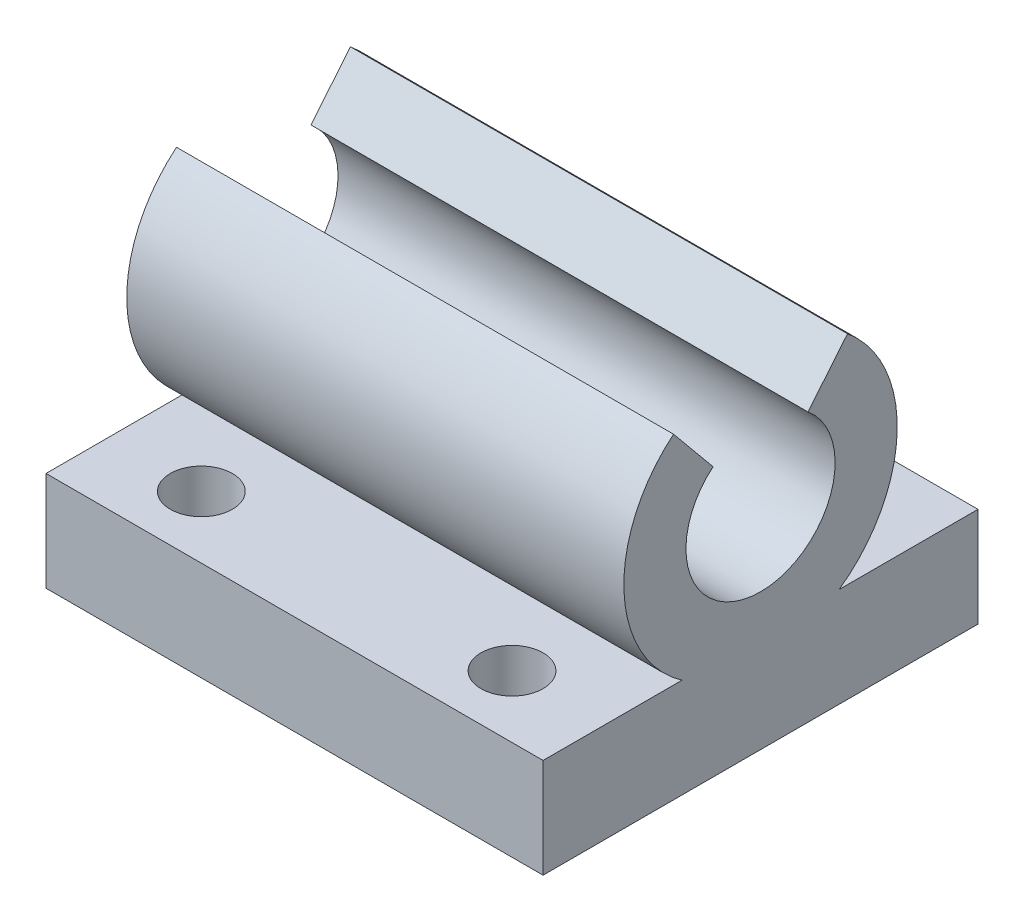
ISO-10303-21;
HEADER;
FILE_DESCRIPTION(('STEP AP214'),'2;1');
FILE_NAME('part.step','',(''),(''),'','','');
FILE_SCHEMA(('AUTOMOTIVE_DESIGN { 1 0 10303 214 1 1 1 1 }'));
ENDSEC;
DATA;
#1=APPLICATION_CONTEXT('core data for automotive mechanical design processes');
#2=APPLICATION_PROTOCOL_DEFINITION('international standard','automotive_design',2000,#1);
#3=PRODUCT_CONTEXT('',#1,'mechanical');
#4=PRODUCT('Part','Part','',(#3));
#5=PRODUCT_RELATED_PRODUCT_CATEGORY('part','',(#4));
#6=PRODUCT_DEFINITION_FORMATION('','',#4);
#7=PRODUCT_DEFINITION_CONTEXT('part definition',#1,'design');
#8=PRODUCT_DEFINITION('design','',#6,#7);
#9=PRODUCT_DEFINITION_SHAPE('','',#8);
#10=(LENGTH_UNIT() NAMED_UNIT(*) SI_UNIT(.MILLI.,.METRE.));
#11=(NAMED_UNIT(*) PLANE_ANGLE_UNIT() SI_UNIT($,.RADIAN.));
#12=(NAMED_UNIT(*) SI_UNIT($,.STERADIAN.) SOLID_ANGLE_UNIT());
#13=UNCERTAINTY_MEASURE_WITH_UNIT(LENGTH_MEASURE(1.E-05),#10,'distance_accuracy_value','');
#14=(GEOMETRIC_REPRESENTATION_CONTEXT(3) GLOBAL_UNCERTAINTY_ASSIGNED_CONTEXT((#13)) GLOBAL_UNIT_ASSIGNED_CONTEXT((#10,
#11,#12)) REPRESENTATION_CONTEXT('',''));
#15=CARTESIAN_POINT('',(0.,0.,0.));
#16=DIRECTION('',(0.,0.,1.));
#17=DIRECTION('',(1.,0.,0.));
#18=AXIS2_PLACEMENT_3D('',#15,#16,#17);
#19=CARTESIAN_POINT('',(20.,8.00000000000001,6.32455532033676));
#20=DIRECTION('',(0.,-1.,0.));
#21=DIRECTION('',(0.,0.,-1.));
#22=AXIS2_PLACEMENT_3D('',#19,#20,#21);
#23=PLANE('',#22);
#24=CARTESIAN_POINT('',(12.5,8.,12.5));
#25=DIRECTION('',(0.,-1.,0.));
#26=DIRECTION('',(0.,0.,-1.));
#27=AXIS2_PLACEMENT_3D('',#24,#25,#26);
#28=CIRCLE('',#27,2.5);
#29=CARTESIAN_POINT('',(12.5,8.00000000000001,10.));
#30=VERTEX_POINT('',#29);
#31=EDGE_CURVE('E211',#30,#30,#28,.F.);
#32=ORIENTED_EDGE('',*,*,#31,.F.);
#33=EDGE_LOOP('',(#32));
#34=FACE_BOUND('',#33,.T.);
#35=CARTESIAN_POINT('',(-12.5,8.,12.5));
#36=DIRECTION('',(0.,-1.,0.));
#37=DIRECTION('',(0.,0.,-1.));
#38=AXIS2_PLACEMENT_3D('',#35,#36,#37);
#39=CIRCLE('',#38,2.5);
#40=CARTESIAN_POINT('',(-12.5,8.00000000000001,10.));
#41=VERTEX_POINT('',#40);
#42=EDGE_CURVE('E146',#41,#41,#39,.F.);
#43=ORIENTED_EDGE('',*,*,#42,.F.);
#44=EDGE_LOOP('',(#43));
#45=FACE_BOUND('',#44,.T.);
#46=DIRECTION('',(0.,0.,1.));
#47=VECTOR('',#46,1.);
#48=CARTESIAN_POINT('',(-20.,8.00000000000001,6.32455532033676));
#49=LINE('',#48,#47);
#50=CARTESIAN_POINT('',(-20.,8.00000000000001,6.32455532033677));
#51=VERTEX_POINT('',#50);
#52=CARTESIAN_POINT('',(-20.,8.,17.5));
#53=VERTEX_POINT('',#52);
#54=EDGE_CURVE('E142',#51,#53,#49,.T.);
#55=ORIENTED_EDGE('',*,*,#54,.T.);
#56=DIRECTION('',(-1.,0.,0.));
#57=VECTOR('',#56,1.);
#58=CARTESIAN_POINT('',(20.,8.,17.5));
#59=LINE('',#58,#57);
#60=CARTESIAN_POINT('',(20.,8.,17.5));
#61=VERTEX_POINT('',#60);
#62=EDGE_CURVE('E11',#61,#53,#59,.T.);
#63=ORIENTED_EDGE('',*,*,#62,.F.);
#64=DIRECTION('',(0.,0.,1.));
#65=VECTOR('',#64,1.);
#66=CARTESIAN_POINT('',(20.,8.00000000000001,6.32455532033676));
#67=LINE('',#66,#65);
#68=CARTESIAN_POINT('',(20.,8.00000000000001,6.32455532033677));
#69=VERTEX_POINT('',#68);
#70=EDGE_CURVE('E161',#69,#61,#67,.T.);
#71=ORIENTED_EDGE('',*,*,#70,.F.);
#72=DIRECTION('',(-1.,0.,0.));
#73=VECTOR('',#72,1.);
#74=CARTESIAN_POINT('',(20.,8.00000000000001,6.32455532033677));
#75=LINE('',#74,#73);
#76=EDGE_CURVE('E138',#69,#51,#75,.T.);
#77=ORIENTED_EDGE('',*,*,#76,.T.);
#78=EDGE_LOOP('',(#55,#63,#71,#77));
#79=FACE_BOUND('',#78,.T.);
#80=ADVANCED_FACE('F34',(#34,#45,#79),#23,.F.);
#81=CARTESIAN_POINT('',(20.,8.,17.5));
#82=DIRECTION('',(0.,0.,-1.));
#83=DIRECTION('',(-1.,0.,0.));
#84=AXIS2_PLACEMENT_3D('',#81,#82,#83);
#85=PLANE('',#84);
#86=DIRECTION('',(0.,-1.,0.));
#87=VECTOR('',#86,1.);
#88=CARTESIAN_POINT('',(-20.,8.,17.5));
#89=LINE('',#88,#87);
#90=CARTESIAN_POINT('',(-20.,0.,17.5));
#91=VERTEX_POINT('',#90);
#92=EDGE_CURVE('E145',#53,#91,#89,.T.);
#93=ORIENTED_EDGE('',*,*,#92,.T.);
#94=DIRECTION('',(-1.,0.,0.));
#95=VECTOR('',#94,1.);
#96=CARTESIAN_POINT('',(20.,0.,17.5));
#97=LINE('',#96,#95);
#98=CARTESIAN_POINT('',(20.,0.,17.5));
#99=VERTEX_POINT('',#98);
#100=EDGE_CURVE('E42',#99,#91,#97,.T.);
#101=ORIENTED_EDGE('',*,*,#100,.F.);
#102=DIRECTION('',(0.,-1.,0.));
#103=VECTOR('',#102,1.);
#104=CARTESIAN_POINT('',(20.,8.,17.5));
#105=LINE('',#104,#103);
#106=EDGE_CURVE('E99',#61,#99,#105,.T.);
#107=ORIENTED_EDGE('',*,*,#106,.F.);
#108=ORIENTED_EDGE('',*,*,#62,.T.);
#109=EDGE_LOOP('',(#93,#101,#107,#108));
#110=FACE_BOUND('',#109,.T.);
#111=ADVANCED_FACE('F248',(#110),#85,.F.);
#112=CARTESIAN_POINT('',(20.,0.,17.5));
#113=DIRECTION('',(0.,1.,0.));
#114=DIRECTION('',(0.,0.,1.));
#115=AXIS2_PLACEMENT_3D('',#112,#113,#114);
#116=PLANE('',#115);
#117=CARTESIAN_POINT('',(12.5,0.,12.5));
#118=DIRECTION('',(0.,-1.,0.));
#119=DIRECTION('',(0.,0.,-1.));
#120=AXIS2_PLACEMENT_3D('',#117,#118,#119);
#121=CIRCLE('',#120,2.5);
#122=CARTESIAN_POINT('',(12.5,0.,10.));
#123=VERTEX_POINT('',#122);
#124=EDGE_CURVE('E221',#123,#123,#121,.T.);
#125=ORIENTED_EDGE('',*,*,#124,.F.);
#126=EDGE_LOOP('',(#125));
#127=FACE_BOUND('',#126,.T.);
#128=CARTESIAN_POINT('',(-12.5,0.,-12.5));
#129=DIRECTION('',(0.,-1.,0.));
#130=DIRECTION('',(0.,0.,-1.));
#131=AXIS2_PLACEMENT_3D('',#128,#129,#130);
#132=CIRCLE('',#131,2.5);
#133=CARTESIAN_POINT('',(-12.5,0.,-15.));
#134=VERTEX_POINT('',#133);
#135=EDGE_CURVE('E214',#134,#134,#132,.T.);
#136=ORIENTED_EDGE('',*,*,#135,.F.);
#137=EDGE_LOOP('',(#136));
#138=FACE_BOUND('',#137,.T.);
#139=CARTESIAN_POINT('',(12.5,0.,-12.5));
#140=DIRECTION('',(0.,-1.,0.));
#141=DIRECTION('',(0.,0.,-1.));
#142=AXIS2_PLACEMENT_3D('',#139,#140,#141);
#143=CIRCLE('',#142,2.5);
#144=CARTESIAN_POINT('',(12.5,0.,-15.));
#145=VERTEX_POINT('',#144);
#146=EDGE_CURVE('E226',#145,#145,#143,.T.);
#147=ORIENTED_EDGE('',*,*,#146,.F.);
#148=EDGE_LOOP('',(#147));
#149=FACE_BOUND('',#148,.T.);
#150=CARTESIAN_POINT('',(-12.5,0.,12.5));
#151=DIRECTION('',(0.,-1.,0.));
#152=DIRECTION('',(0.,0.,-1.));
#153=AXIS2_PLACEMENT_3D('',#150,#151,#152);
#154=CIRCLE('',#153,2.5);
#155=CARTESIAN_POINT('',(-12.5,0.,10.));
#156=VERTEX_POINT('',#155);
#157=EDGE_CURVE('E208',#156,#156,#154,.T.);
#158=ORIENTED_EDGE('',*,*,#157,.F.);
#159=EDGE_LOOP('',(#158));
#160=FACE_BOUND('',#159,.T.);
#161=DIRECTION('',(0.,0.,-1.));
#162=VECTOR('',#161,1.);
#163=CARTESIAN_POINT('',(-20.,0.,17.5));
#164=LINE('',#163,#162);
#165=CARTESIAN_POINT('',(-20.,0.,-17.5));
#166=VERTEX_POINT('',#165);
#167=EDGE_CURVE('E148',#91,#166,#164,.T.);
#168=ORIENTED_EDGE('',*,*,#167,.T.);
#169=DIRECTION('',(-1.,0.,0.));
#170=VECTOR('',#169,1.);
#171=CARTESIAN_POINT('',(20.,0.,-17.5));
#172=LINE('',#171,#170);
#173=CARTESIAN_POINT('',(20.,0.,-17.5));
#174=VERTEX_POINT('',#173);
#175=EDGE_CURVE('E174',#174,#166,#172,.T.);
#176=ORIENTED_EDGE('',*,*,#175,.F.);
#177=DIRECTION('',(0.,0.,-1.));
#178=VECTOR('',#177,1.);
#179=CARTESIAN_POINT('',(20.,0.,17.5));
#180=LINE('',#179,#178);
#181=EDGE_CURVE('E182',#99,#174,#180,.T.);
#182=ORIENTED_EDGE('',*,*,#181,.F.);
#183=ORIENTED_EDGE('',*,*,#100,.T.);
#184=EDGE_LOOP('',(#168,#176,#182,#183));
#185=FACE_BOUND('',#184,.T.);
#186=ADVANCED_FACE('F180',(#127,#138,#149,#160,#185),#116,.F.);
#187=CARTESIAN_POINT('',(20.,0.,-17.5));
#188=DIRECTION('',(0.,0.,1.));
#189=DIRECTION('',(1.,0.,0.));
#190=AXIS2_PLACEMENT_3D('',#187,#188,#189);
#191=PLANE('',#190);
#192=DIRECTION('',(0.,1.,0.));
#193=VECTOR('',#192,1.);
#194=CARTESIAN_POINT('',(-20.,0.,-17.5));
#195=LINE('',#194,#193);
#196=CARTESIAN_POINT('',(-20.,8.,-17.5));
#197=VERTEX_POINT('',#196);
#198=EDGE_CURVE('E150',#166,#197,#195,.T.);
#199=ORIENTED_EDGE('',*,*,#198,.T.);
#200=DIRECTION('',(-1.,0.,0.));
#201=VECTOR('',#200,1.);
#202=CARTESIAN_POINT('',(20.,8.,-17.5));
#203=LINE('',#202,#201);
#204=CARTESIAN_POINT('',(20.,8.,-17.5));
#205=VERTEX_POINT('',#204);
#206=EDGE_CURVE('E171',#205,#197,#203,.T.);
#207=ORIENTED_EDGE('',*,*,#206,.F.);
#208=DIRECTION('',(0.,1.,0.));
#209=VECTOR('',#208,1.);
#210=CARTESIAN_POINT('',(20.,0.,-17.5));
#211=LINE('',#210,#209);
#212=EDGE_CURVE('E200',#174,#205,#211,.T.);
#213=ORIENTED_EDGE('',*,*,#212,.F.);
#214=ORIENTED_EDGE('',*,*,#175,.T.);
#215=EDGE_LOOP('',(#199,#207,#213,#214));
#216=FACE_BOUND('',#215,.T.);
#217=ADVANCED_FACE('F191',(#216),#191,.F.);
#218=CARTESIAN_POINT('',(20.,8.,-17.5));
#219=DIRECTION('',(0.,-1.,0.));
#220=DIRECTION('',(0.,0.,-1.));
#221=AXIS2_PLACEMENT_3D('',#218,#219,#220);
#222=PLANE('',#221);
#223=CARTESIAN_POINT('',(-12.5,8.,-12.5));
#224=DIRECTION('',(0.,-1.,0.));
#225=DIRECTION('',(0.,0.,-1.));
#226=AXIS2_PLACEMENT_3D('',#223,#224,#225);
#227=CIRCLE('',#226,2.5);
#228=CARTESIAN_POINT('',(-12.5,8.,-15.));
#229=VERTEX_POINT('',#228);
#230=EDGE_CURVE('E217',#229,#229,#227,.F.);
#231=ORIENTED_EDGE('',*,*,#230,.F.);
#232=EDGE_LOOP('',(#231));
#233=FACE_BOUND('',#232,.T.);
#234=CARTESIAN_POINT('',(12.5,8.,-12.5));
#235=DIRECTION('',(0.,-1.,0.));
#236=DIRECTION('',(0.,0.,-1.));
#237=AXIS2_PLACEMENT_3D('',#234,#235,#236);
#238=CIRCLE('',#237,2.5);
#239=CARTESIAN_POINT('',(12.5,8.,-15.));
#240=VERTEX_POINT('',#239);
#241=EDGE_CURVE('E218',#240,#240,#238,.F.);
#242=ORIENTED_EDGE('',*,*,#241,.F.);
#243=EDGE_LOOP('',(#242));
#244=FACE_BOUND('',#243,.T.);
#245=DIRECTION('',(0.,0.,1.));
#246=VECTOR('',#245,1.);
#247=CARTESIAN_POINT('',(-20.,8.,-17.5));
#248=LINE('',#247,#246);
#249=CARTESIAN_POINT('',(-20.,8.00000000000001,-6.32455532033676));
#250=VERTEX_POINT('',#249);
#251=EDGE_CURVE('E152',#197,#250,#248,.T.);
#252=ORIENTED_EDGE('',*,*,#251,.T.);
#253=DIRECTION('',(-1.,0.,0.));
#254=VECTOR('',#253,1.);
#255=CARTESIAN_POINT('',(20.,8.00000000000001,-6.32455532033676));
#256=LINE('',#255,#254);
#257=CARTESIAN_POINT('',(20.,8.00000000000001,-6.32455532033676));
#258=VERTEX_POINT('',#257);
#259=EDGE_CURVE('E168',#258,#250,#256,.T.);
#260=ORIENTED_EDGE('',*,*,#259,.F.);
#261=DIRECTION('',(0.,0.,1.));
#262=VECTOR('',#261,1.);
#263=CARTESIAN_POINT('',(20.,8.,-17.5));
#264=LINE('',#263,#262);
#265=EDGE_CURVE('E197',#205,#258,#264,.T.);
#266=ORIENTED_EDGE('',*,*,#265,.F.);
#267=ORIENTED_EDGE('',*,*,#206,.T.);
#268=EDGE_LOOP('',(#252,#260,#266,#267));
#269=FACE_BOUND('',#268,.T.);
#270=ADVANCED_FACE('F195',(#233,#244,#269),#222,.F.);
#271=CARTESIAN_POINT('',(20.,17.,0.));
#272=DIRECTION('',(-1.,0.,0.));
#273=DIRECTION('',(0.,0.,1.));
#274=AXIS2_PLACEMENT_3D('',#271,#272,#273);
#275=CYLINDRICAL_SURFACE('',#274,11.);
#276=CARTESIAN_POINT('',(-20.,17.,0.));
#277=DIRECTION('',(1.,0.,0.));
#278=DIRECTION('',(0.,0.,-1.));
#279=AXIS2_PLACEMENT_3D('',#276,#277,#278);
#280=CIRCLE('',#279,11.);
#281=CARTESIAN_POINT('',(-20.,25.4852813742386,-7.));
#282=VERTEX_POINT('',#281);
#283=EDGE_CURVE('E154',#250,#282,#280,.T.);
#284=ORIENTED_EDGE('',*,*,#283,.T.);
#285=DIRECTION('',(-1.,0.,0.));
#286=VECTOR('',#285,1.);
#287=CARTESIAN_POINT('',(20.,25.4852813742386,-7.));
#288=LINE('',#287,#286);
#289=CARTESIAN_POINT('',(20.,25.4852813742386,-7.));
#290=VERTEX_POINT('',#289);
#291=EDGE_CURVE('E165',#290,#282,#288,.T.);
#292=ORIENTED_EDGE('',*,*,#291,.F.);
#293=CARTESIAN_POINT('',(20.,17.,0.));
#294=DIRECTION('',(1.,0.,0.));
#295=DIRECTION('',(0.,0.,-1.));
#296=AXIS2_PLACEMENT_3D('',#293,#294,#295);
#297=CIRCLE('',#296,11.);
#298=EDGE_CURVE('E199',#258,#290,#297,.T.);
#299=ORIENTED_EDGE('',*,*,#298,.F.);
#300=ORIENTED_EDGE('',*,*,#259,.T.);
#301=EDGE_LOOP('',(#284,#292,#299,#300));
#302=FACE_BOUND('',#301,.T.);
#303=ADVANCED_FACE('F235',(#302),#275,.T.);
#304=CARTESIAN_POINT('',(20.,21.6283352950392,-3.81818181818182));
#305=DIRECTION('',(0.,-0.636363636363637,-0.77138921583987));
#306=DIRECTION('',(0.,0.77138921583987,-0.636363636363637));
#307=AXIS2_PLACEMENT_3D('',#304,#305,#306);
#308=PLANE('',#307);
#309=DIRECTION('',(0.,-0.77138921583987,0.636363636363637));
#310=VECTOR('',#309,1.);
#311=CARTESIAN_POINT('',(-20.,21.6283352950392,-3.81818181818182));
#312=LINE('',#311,#310);
#313=CARTESIAN_POINT('',(-20.,21.6283352950392,-3.81818181818182));
#314=VERTEX_POINT('',#313);
#315=EDGE_CURVE('E156',#282,#314,#312,.T.);
#316=ORIENTED_EDGE('',*,*,#315,.T.);
#317=DIRECTION('',(-1.,0.,0.));
#318=VECTOR('',#317,1.);
#319=CARTESIAN_POINT('',(20.,21.6283352950392,-3.81818181818182));
#320=LINE('',#319,#318);
#321=CARTESIAN_POINT('',(20.,21.6283352950392,-3.81818181818182));
#322=VERTEX_POINT('',#321);
#323=EDGE_CURVE('E133',#322,#314,#320,.T.);
#324=ORIENTED_EDGE('',*,*,#323,.F.);
#325=DIRECTION('',(0.,-0.77138921583987,0.636363636363637));
#326=VECTOR('',#325,1.);
#327=CARTESIAN_POINT('',(20.,21.6283352950392,-3.81818181818182));
#328=LINE('',#327,#326);
#329=EDGE_CURVE('E124',#290,#322,#328,.T.);
#330=ORIENTED_EDGE('',*,*,#329,.F.);
#331=ORIENTED_EDGE('',*,*,#291,.T.);
#332=EDGE_LOOP('',(#316,#324,#330,#331));
#333=FACE_BOUND('',#332,.T.);
#334=ADVANCED_FACE('F242',(#333),#308,.F.);
#335=CARTESIAN_POINT('',(20.,17.,0.));
#336=DIRECTION('',(-1.,0.,0.));
#337=DIRECTION('',(0.,0.,1.));
#338=AXIS2_PLACEMENT_3D('',#335,#336,#337);
#339=CYLINDRICAL_SURFACE('',#338,6.);
#340=CARTESIAN_POINT('',(-20.,17.,0.));
#341=DIRECTION('',(-1.,0.,0.));
#342=DIRECTION('',(0.,0.,-1.));
#343=AXIS2_PLACEMENT_3D('',#340,#341,#342);
#344=CIRCLE('',#343,6.);
#345=CARTESIAN_POINT('',(-20.,21.6283352950392,3.81818181818182));
#346=VERTEX_POINT('',#345);
#347=EDGE_CURVE('E132',#314,#346,#344,.T.);
#348=ORIENTED_EDGE('',*,*,#347,.T.);
#349=DIRECTION('',(-1.,0.,0.));
#350=VECTOR('',#349,1.);
#351=CARTESIAN_POINT('',(20.,21.6283352950392,3.81818181818182));
#352=LINE('',#351,#350);
#353=CARTESIAN_POINT('',(20.,21.6283352950392,3.81818181818182));
#354=VERTEX_POINT('',#353);
#355=EDGE_CURVE('E129',#354,#346,#352,.T.);
#356=ORIENTED_EDGE('',*,*,#355,.F.);
#357=CARTESIAN_POINT('',(20.,17.,0.));
#358=DIRECTION('',(-1.,0.,0.));
#359=DIRECTION('',(0.,0.,-1.));
#360=AXIS2_PLACEMENT_3D('',#357,#358,#359);
#361=CIRCLE('',#360,6.);
#362=EDGE_CURVE('E118',#322,#354,#361,.T.);
#363=ORIENTED_EDGE('',*,*,#362,.F.);
#364=ORIENTED_EDGE('',*,*,#323,.T.);
#365=EDGE_LOOP('',(#348,#356,#363,#364));
#366=FACE_BOUND('',#365,.T.);
#367=ADVANCED_FACE('F130',(#366),#339,.F.);
#368=CARTESIAN_POINT('',(20.,21.6283352950392,3.81818181818182));
#369=DIRECTION('',(0.,-0.636363636363636,0.77138921583987));
#370=DIRECTION('',(0.,-0.77138921583987,-0.636363636363636));
#371=AXIS2_PLACEMENT_3D('',#368,#369,#370);
#372=PLANE('',#371);
#373=DIRECTION('',(0.,0.77138921583987,0.636363636363636));
#374=VECTOR('',#373,1.);
#375=CARTESIAN_POINT('',(-20.,21.6283352950392,3.81818181818182));
#376=LINE('',#375,#374);
#377=CARTESIAN_POINT('',(-20.,25.4852813742386,7.));
#378=VERTEX_POINT('',#377);
#379=EDGE_CURVE('E85',#346,#378,#376,.T.);
#380=ORIENTED_EDGE('',*,*,#379,.T.);
#381=DIRECTION('',(-1.,0.,0.));
#382=VECTOR('',#381,1.);
#383=CARTESIAN_POINT('',(20.,25.4852813742386,7.));
#384=LINE('',#383,#382);
#385=CARTESIAN_POINT('',(20.,25.4852813742386,7.));
#386=VERTEX_POINT('',#385);
#387=EDGE_CURVE('E134',#386,#378,#384,.T.);
#388=ORIENTED_EDGE('',*,*,#387,.F.);
#389=DIRECTION('',(0.,0.77138921583987,0.636363636363636));
#390=VECTOR('',#389,1.);
#391=CARTESIAN_POINT('',(20.,21.6283352950392,3.81818181818182));
#392=LINE('',#391,#390);
#393=EDGE_CURVE('E122',#354,#386,#392,.T.);
#394=ORIENTED_EDGE('',*,*,#393,.F.);
#395=ORIENTED_EDGE('',*,*,#355,.T.);
#396=EDGE_LOOP('',(#380,#388,#394,#395));
#397=FACE_BOUND('',#396,.T.);
#398=ADVANCED_FACE('F136',(#397),#372,.F.);
#399=CARTESIAN_POINT('',(20.,17.,0.));
#400=DIRECTION('',(-1.,0.,0.));
#401=DIRECTION('',(0.,0.,1.));
#402=AXIS2_PLACEMENT_3D('',#399,#400,#401);
#403=CYLINDRICAL_SURFACE('',#402,11.);
#404=CARTESIAN_POINT('',(-20.,17.,0.));
#405=DIRECTION('',(1.,0.,0.));
#406=DIRECTION('',(0.,0.,-1.));
#407=AXIS2_PLACEMENT_3D('',#404,#405,#406);
#408=CIRCLE('',#407,11.);
#409=EDGE_CURVE('E91',#378,#51,#408,.T.);
#410=ORIENTED_EDGE('',*,*,#409,.T.);
#411=ORIENTED_EDGE('',*,*,#76,.F.);
#412=CARTESIAN_POINT('',(20.,17.,0.));
#413=DIRECTION('',(1.,0.,0.));
#414=DIRECTION('',(0.,0.,-1.));
#415=AXIS2_PLACEMENT_3D('',#412,#413,#414);
#416=CIRCLE('',#415,11.);
#417=EDGE_CURVE('E50',#386,#69,#416,.T.);
#418=ORIENTED_EDGE('',*,*,#417,.F.);
#419=ORIENTED_EDGE('',*,*,#387,.T.);
#420=EDGE_LOOP('',(#410,#411,#418,#419));
#421=FACE_BOUND('',#420,.T.);
#422=ADVANCED_FACE('F271',(#421),#403,.T.);
#423=CARTESIAN_POINT('',(20.,17.,0.));
#424=DIRECTION('',(1.,0.,0.));
#425=DIRECTION('',(0.,0.,-1.));
#426=AXIS2_PLACEMENT_3D('',#423,#424,#425);
#427=PLANE('',#426);
#428=ORIENTED_EDGE('',*,*,#70,.T.);
#429=ORIENTED_EDGE('',*,*,#106,.T.);
#430=ORIENTED_EDGE('',*,*,#181,.T.);
#431=ORIENTED_EDGE('',*,*,#212,.T.);
#432=ORIENTED_EDGE('',*,*,#265,.T.);
#433=ORIENTED_EDGE('',*,*,#298,.T.);
#434=ORIENTED_EDGE('',*,*,#329,.T.);
#435=ORIENTED_EDGE('',*,*,#362,.T.);
#436=ORIENTED_EDGE('',*,*,#393,.T.);
#437=ORIENTED_EDGE('',*,*,#417,.T.);
#438=EDGE_LOOP('',(#428,#429,#430,#431,#432,#433,#434,#435,#436,#437));
#439=FACE_BOUND('',#438,.T.);
#440=ADVANCED_FACE('F120',(#439),#427,.T.);
#441=CARTESIAN_POINT('',(-20.,17.,0.));
#442=DIRECTION('',(1.,0.,0.));
#443=DIRECTION('',(0.,0.,-1.));
#444=AXIS2_PLACEMENT_3D('',#441,#442,#443);
#445=PLANE('',#444);
#446=ORIENTED_EDGE('',*,*,#54,.F.);
#447=ORIENTED_EDGE('',*,*,#409,.F.);
#448=ORIENTED_EDGE('',*,*,#379,.F.);
#449=ORIENTED_EDGE('',*,*,#347,.F.);
#450=ORIENTED_EDGE('',*,*,#315,.F.);
#451=ORIENTED_EDGE('',*,*,#283,.F.);
#452=ORIENTED_EDGE('',*,*,#251,.F.);
#453=ORIENTED_EDGE('',*,*,#198,.F.);
#454=ORIENTED_EDGE('',*,*,#167,.F.);
#455=ORIENTED_EDGE('',*,*,#92,.F.);
#456=EDGE_LOOP('',(#446,#447,#448,#449,#450,#451,#452,#453,#454,#455));
#457=FACE_BOUND('',#456,.T.);
#458=ADVANCED_FACE('F186',(#457),#445,.F.);
#459=CARTESIAN_POINT('',(12.5,25.4862813742386,-12.5));
#460=DIRECTION('',(0.,-1.,0.));
#461=DIRECTION('',(0.,0.,-1.));
#462=AXIS2_PLACEMENT_3D('',#459,#460,#461);
#463=CYLINDRICAL_SURFACE('',#462,2.5);
#464=ORIENTED_EDGE('',*,*,#146,.T.);
#465=EDGE_LOOP('',(#464));
#466=FACE_BOUND('',#465,.T.);
#467=ORIENTED_EDGE('',*,*,#241,.T.);
#468=EDGE_LOOP('',(#467));
#469=FACE_BOUND('',#468,.T.);
#470=ADVANCED_FACE('F232',(#466,#469),#463,.F.);
#471=CARTESIAN_POINT('',(-12.5,25.4862813742386,-12.5));
#472=DIRECTION('',(0.,-1.,0.));
#473=DIRECTION('',(0.,0.,-1.));
#474=AXIS2_PLACEMENT_3D('',#471,#472,#473);
#475=CYLINDRICAL_SURFACE('',#474,2.5);
#476=ORIENTED_EDGE('',*,*,#135,.T.);
#477=EDGE_LOOP('',(#476));
#478=FACE_BOUND('',#477,.T.);
#479=ORIENTED_EDGE('',*,*,#230,.T.);
#480=EDGE_LOOP('',(#479));
#481=FACE_BOUND('',#480,.T.);
#482=ADVANCED_FACE('F282',(#478,#481),#475,.F.);
#483=CARTESIAN_POINT('',(-12.5,25.4862813742386,12.5));
#484=DIRECTION('',(0.,-1.,0.));
#485=DIRECTION('',(0.,0.,-1.));
#486=AXIS2_PLACEMENT_3D('',#483,#484,#485);
#487=CYLINDRICAL_SURFACE('',#486,2.5);
#488=ORIENTED_EDGE('',*,*,#157,.T.);
#489=EDGE_LOOP('',(#488));
#490=FACE_BOUND('',#489,.T.);
#491=ORIENTED_EDGE('',*,*,#42,.T.);
#492=EDGE_LOOP('',(#491));
#493=FACE_BOUND('',#492,.T.);
#494=ADVANCED_FACE('F278',(#490,#493),#487,.F.);
#495=CARTESIAN_POINT('',(12.5,25.4862813742386,12.5));
#496=DIRECTION('',(0.,-1.,0.));
#497=DIRECTION('',(0.,0.,-1.));
#498=AXIS2_PLACEMENT_3D('',#495,#496,#497);
#499=CYLINDRICAL_SURFACE('',#498,2.5);
#500=ORIENTED_EDGE('',*,*,#124,.T.);
#501=EDGE_LOOP('',(#500));
#502=FACE_BOUND('',#501,.T.);
#503=ORIENTED_EDGE('',*,*,#31,.T.);
#504=EDGE_LOOP('',(#503));
#505=FACE_BOUND('',#504,.T.);
#506=ADVANCED_FACE('F281',(#502,#505),#499,.F.);
#507=CLOSED_SHELL('',(#80,#111,#186,#217,#270,#303,#334,#367,#398,#422,#440,#458,#470,#482,#494,#506));
#508=MANIFOLD_SOLID_BREP('B2',#507);
#509=ADVANCED_BREP_SHAPE_REPRESENTATION('',(#18,#508),#14);
#510=SHAPE_DEFINITION_REPRESENTATION(#9,#509);
ENDSEC;
END-ISO-10303-21;
